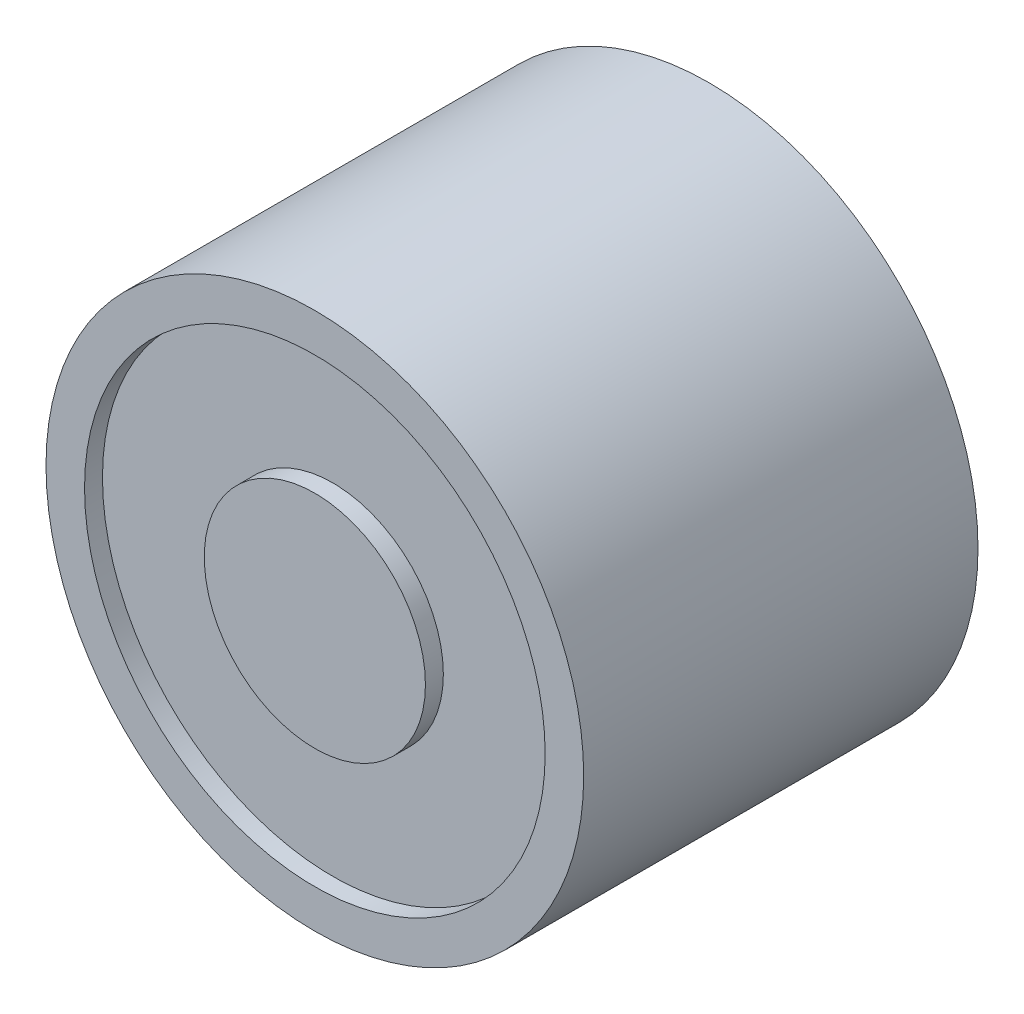
ISO-10303-21;
HEADER;
FILE_DESCRIPTION(('STEP AP214'),'2;1');
FILE_NAME('part.step','',(''),(''),'','','');
FILE_SCHEMA(('AUTOMOTIVE_DESIGN { 1 0 10303 214 1 1 1 1 }'));
ENDSEC;
DATA;
#1=APPLICATION_CONTEXT('core data for automotive mechanical design processes');
#2=APPLICATION_PROTOCOL_DEFINITION('international standard','automotive_design',2000,#1);
#3=PRODUCT_CONTEXT('',#1,'mechanical');
#4=PRODUCT('Part','Part','',(#3));
#5=PRODUCT_RELATED_PRODUCT_CATEGORY('part','',(#4));
#6=PRODUCT_DEFINITION_FORMATION('','',#4);
#7=PRODUCT_DEFINITION_CONTEXT('part definition',#1,'design');
#8=PRODUCT_DEFINITION('design','',#6,#7);
#9=PRODUCT_DEFINITION_SHAPE('','',#8);
#10=(LENGTH_UNIT() NAMED_UNIT(*) SI_UNIT(.MILLI.,.METRE.));
#11=(NAMED_UNIT(*) PLANE_ANGLE_UNIT() SI_UNIT($,.RADIAN.));
#12=(NAMED_UNIT(*) SI_UNIT($,.STERADIAN.) SOLID_ANGLE_UNIT());
#13=UNCERTAINTY_MEASURE_WITH_UNIT(LENGTH_MEASURE(1.E-05),#10,'distance_accuracy_value','');
#14=(GEOMETRIC_REPRESENTATION_CONTEXT(3) GLOBAL_UNCERTAINTY_ASSIGNED_CONTEXT((#13)) GLOBAL_UNIT_ASSIGNED_CONTEXT((#10,
#11,#12)) REPRESENTATION_CONTEXT('',''));
#15=CARTESIAN_POINT('',(0.,0.,0.));
#16=DIRECTION('',(0.,0.,1.));
#17=DIRECTION('',(1.,0.,0.));
#18=AXIS2_PLACEMENT_3D('',#15,#16,#17);
#19=CARTESIAN_POINT('',(0.,0.,22.));
#20=DIRECTION('',(0.,0.,-1.));
#21=DIRECTION('',(-1.,0.,0.));
#22=AXIS2_PLACEMENT_3D('',#19,#20,#21);
#23=CYLINDRICAL_SURFACE('',#22,15.);
#24=CARTESIAN_POINT('',(0.,0.,22.));
#25=DIRECTION('',(0.,0.,1.));
#26=DIRECTION('',(1.,0.,0.));
#27=AXIS2_PLACEMENT_3D('',#24,#25,#26);
#28=CIRCLE('',#27,15.);
#29=CARTESIAN_POINT('',(15.,0.,22.));
#30=VERTEX_POINT('',#29);
#31=EDGE_CURVE('E10',#30,#30,#28,.T.);
#32=ORIENTED_EDGE('',*,*,#31,.F.);
#33=EDGE_LOOP('',(#32));
#34=FACE_BOUND('',#33,.T.);
#35=CARTESIAN_POINT('',(0.,0.,0.));
#36=DIRECTION('',(0.,0.,1.));
#37=DIRECTION('',(1.,0.,0.));
#38=AXIS2_PLACEMENT_3D('',#35,#36,#37);
#39=CIRCLE('',#38,15.);
#40=CARTESIAN_POINT('',(15.,0.,0.));
#41=VERTEX_POINT('',#40);
#42=EDGE_CURVE('E36',#41,#41,#39,.T.);
#43=ORIENTED_EDGE('',*,*,#42,.T.);
#44=EDGE_LOOP('',(#43));
#45=FACE_BOUND('',#44,.T.);
#46=ADVANCED_FACE('F33',(#34,#45),#23,.T.);
#47=CARTESIAN_POINT('',(0.,0.,22.));
#48=DIRECTION('',(0.,0.,1.));
#49=DIRECTION('',(1.,0.,0.));
#50=AXIS2_PLACEMENT_3D('',#47,#48,#49);
#51=PLANE('',#50);
#52=CARTESIAN_POINT('',(0.,0.,22.));
#53=DIRECTION('',(0.,0.,1.));
#54=DIRECTION('',(1.,0.,0.));
#55=AXIS2_PLACEMENT_3D('',#52,#53,#54);
#56=CIRCLE('',#55,12.85);
#57=CARTESIAN_POINT('',(12.85,0.,22.));
#58=VERTEX_POINT('',#57);
#59=EDGE_CURVE('E45',#58,#58,#56,.T.);
#60=ORIENTED_EDGE('',*,*,#59,.F.);
#61=EDGE_LOOP('',(#60));
#62=FACE_BOUND('',#61,.T.);
#63=ORIENTED_EDGE('',*,*,#31,.T.);
#64=EDGE_LOOP('',(#63));
#65=FACE_BOUND('',#64,.T.);
#66=ADVANCED_FACE('F73',(#62,#65),#51,.T.);
#67=CARTESIAN_POINT('',(0.,0.,0.));
#68=DIRECTION('',(0.,0.,1.));
#69=DIRECTION('',(1.,0.,0.));
#70=AXIS2_PLACEMENT_3D('',#67,#68,#69);
#71=PLANE('',#70);
#72=ORIENTED_EDGE('',*,*,#42,.F.);
#73=EDGE_LOOP('',(#72));
#74=FACE_BOUND('',#73,.T.);
#75=ADVANCED_FACE('F69',(#74),#71,.F.);
#76=CARTESIAN_POINT('',(0.,0.,21.));
#77=DIRECTION('',(0.,0.,1.));
#78=DIRECTION('',(1.,0.,0.));
#79=AXIS2_PLACEMENT_3D('',#76,#77,#78);
#80=CYLINDRICAL_SURFACE('',#79,12.85);
#81=CARTESIAN_POINT('',(0.,0.,21.));
#82=DIRECTION('',(0.,0.,1.));
#83=DIRECTION('',(1.,0.,0.));
#84=AXIS2_PLACEMENT_3D('',#81,#82,#83);
#85=CIRCLE('',#84,12.85);
#86=CARTESIAN_POINT('',(12.85,0.,21.));
#87=VERTEX_POINT('',#86);
#88=EDGE_CURVE('E43',#87,#87,#85,.T.);
#89=ORIENTED_EDGE('',*,*,#88,.F.);
#90=EDGE_LOOP('',(#89));
#91=FACE_BOUND('',#90,.T.);
#92=ORIENTED_EDGE('',*,*,#59,.T.);
#93=EDGE_LOOP('',(#92));
#94=FACE_BOUND('',#93,.T.);
#95=ADVANCED_FACE('F63',(#91,#94),#80,.F.);
#96=CARTESIAN_POINT('',(0.,0.,21.));
#97=DIRECTION('',(0.,0.,1.));
#98=DIRECTION('',(1.,0.,0.));
#99=AXIS2_PLACEMENT_3D('',#96,#97,#98);
#100=PLANE('',#99);
#101=CARTESIAN_POINT('',(0.,0.,21.));
#102=DIRECTION('',(0.,0.,1.));
#103=DIRECTION('',(1.,0.,0.));
#104=AXIS2_PLACEMENT_3D('',#101,#102,#103);
#105=CIRCLE('',#104,6.17);
#106=CARTESIAN_POINT('',(6.17,0.,21.));
#107=VERTEX_POINT('',#106);
#108=EDGE_CURVE('E48',#107,#107,#105,.T.);
#109=ORIENTED_EDGE('',*,*,#108,.F.);
#110=EDGE_LOOP('',(#109));
#111=FACE_BOUND('',#110,.T.);
#112=ORIENTED_EDGE('',*,*,#88,.T.);
#113=EDGE_LOOP('',(#112));
#114=FACE_BOUND('',#113,.T.);
#115=ADVANCED_FACE('F60',(#111,#114),#100,.T.);
#116=CARTESIAN_POINT('',(0.,0.,21.));
#117=DIRECTION('',(0.,0.,1.));
#118=DIRECTION('',(1.,0.,0.));
#119=AXIS2_PLACEMENT_3D('',#116,#117,#118);
#120=CYLINDRICAL_SURFACE('',#119,6.17);
#121=ORIENTED_EDGE('',*,*,#108,.T.);
#122=EDGE_LOOP('',(#121));
#123=FACE_BOUND('',#122,.T.);
#124=CARTESIAN_POINT('',(0.,0.,22.));
#125=DIRECTION('',(0.,0.,1.));
#126=DIRECTION('',(1.,0.,0.));
#127=AXIS2_PLACEMENT_3D('',#124,#125,#126);
#128=CIRCLE('',#127,6.17);
#129=CARTESIAN_POINT('',(6.17,0.,22.));
#130=VERTEX_POINT('',#129);
#131=EDGE_CURVE('E51',#130,#130,#128,.T.);
#132=ORIENTED_EDGE('',*,*,#131,.F.);
#133=EDGE_LOOP('',(#132));
#134=FACE_BOUND('',#133,.T.);
#135=ADVANCED_FACE('F57',(#123,#134),#120,.T.);
#136=ORIENTED_EDGE('',*,*,#131,.T.);
#137=EDGE_LOOP('',(#136));
#138=FACE_BOUND('',#137,.T.);
#139=ADVANCED_FACE('F76',(#138),#51,.T.);
#140=CLOSED_SHELL('',(#46,#66,#75,#95,#115,#135,#139));
#141=MANIFOLD_SOLID_BREP('B2',#140);
#142=ADVANCED_BREP_SHAPE_REPRESENTATION('',(#18,#141),#14);
#143=SHAPE_DEFINITION_REPRESENTATION(#9,#142);
ENDSEC;
END-ISO-10303-21;
